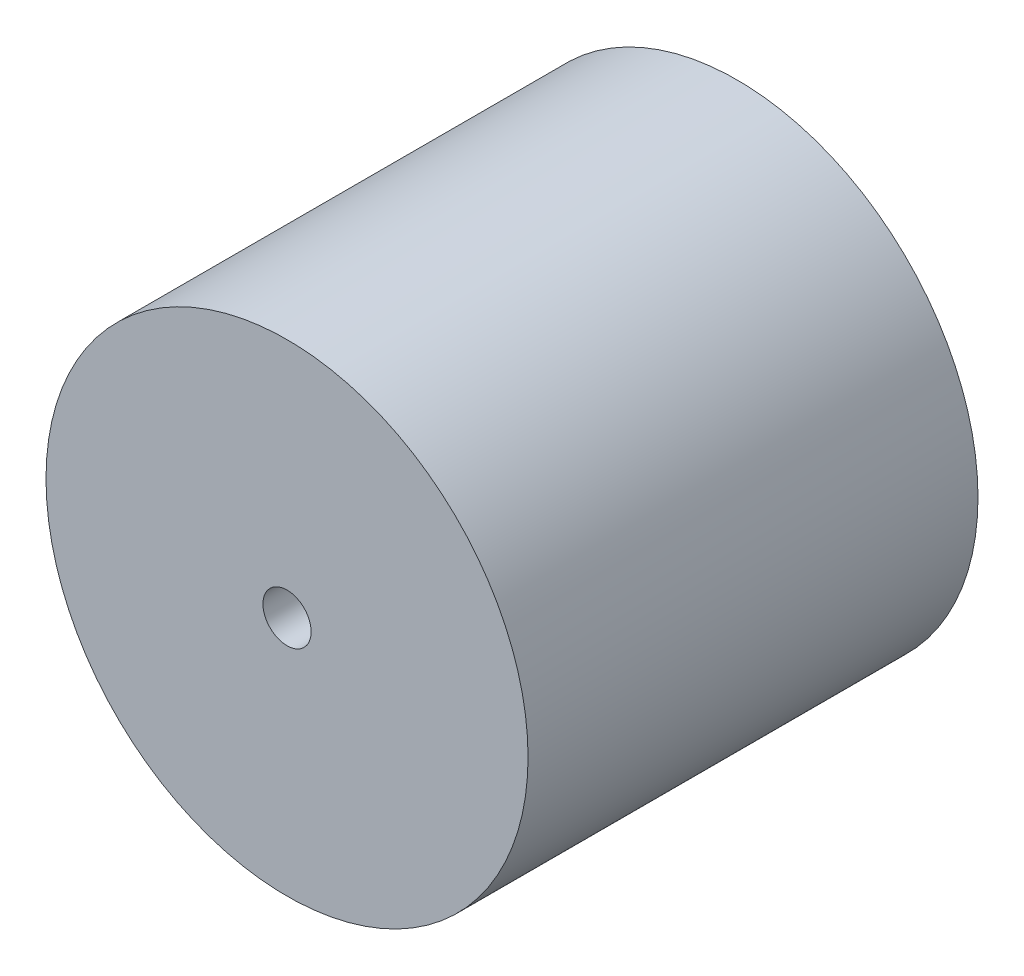
ISO-10303-21;
HEADER;
FILE_DESCRIPTION(('STEP AP214'),'2;1');
FILE_NAME('part.step','',(''),(''),'','','');
FILE_SCHEMA(('AUTOMOTIVE_DESIGN { 1 0 10303 214 1 1 1 1 }'));
ENDSEC;
DATA;
#1=APPLICATION_CONTEXT('core data for automotive mechanical design processes');
#2=APPLICATION_PROTOCOL_DEFINITION('international standard','automotive_design',2000,#1);
#3=PRODUCT_CONTEXT('',#1,'mechanical');
#4=PRODUCT('Part','Part','',(#3));
#5=PRODUCT_RELATED_PRODUCT_CATEGORY('part','',(#4));
#6=PRODUCT_DEFINITION_FORMATION('','',#4);
#7=PRODUCT_DEFINITION_CONTEXT('part definition',#1,'design');
#8=PRODUCT_DEFINITION('design','',#6,#7);
#9=PRODUCT_DEFINITION_SHAPE('','',#8);
#10=(LENGTH_UNIT() NAMED_UNIT(*) SI_UNIT(.MILLI.,.METRE.));
#11=(NAMED_UNIT(*) PLANE_ANGLE_UNIT() SI_UNIT($,.RADIAN.));
#12=(NAMED_UNIT(*) SI_UNIT($,.STERADIAN.) SOLID_ANGLE_UNIT());
#13=UNCERTAINTY_MEASURE_WITH_UNIT(LENGTH_MEASURE(1.E-05),#10,'distance_accuracy_value','');
#14=(GEOMETRIC_REPRESENTATION_CONTEXT(3) GLOBAL_UNCERTAINTY_ASSIGNED_CONTEXT((#13)) GLOBAL_UNIT_ASSIGNED_CONTEXT((#10,
#11,#12)) REPRESENTATION_CONTEXT('',''));
#15=CARTESIAN_POINT('',(0.,0.,0.));
#16=DIRECTION('',(0.,0.,1.));
#17=DIRECTION('',(1.,0.,0.));
#18=AXIS2_PLACEMENT_3D('',#15,#16,#17);
#19=CARTESIAN_POINT('',(0.,0.,28.));
#20=DIRECTION('',(0.,0.,-1.));
#21=DIRECTION('',(-1.,0.,0.));
#22=AXIS2_PLACEMENT_3D('',#19,#20,#21);
#23=CYLINDRICAL_SURFACE('',#22,15.);
#24=CARTESIAN_POINT('',(0.,0.,28.));
#25=DIRECTION('',(0.,0.,1.));
#26=DIRECTION('',(1.,0.,0.));
#27=AXIS2_PLACEMENT_3D('',#24,#25,#26);
#28=CIRCLE('',#27,15.);
#29=CARTESIAN_POINT('',(15.,0.,28.));
#30=VERTEX_POINT('',#29);
#31=EDGE_CURVE('E10',#30,#30,#28,.T.);
#32=ORIENTED_EDGE('',*,*,#31,.F.);
#33=EDGE_LOOP('',(#32));
#34=FACE_BOUND('',#33,.T.);
#35=CARTESIAN_POINT('',(0.,0.,0.));
#36=DIRECTION('',(0.,0.,1.));
#37=DIRECTION('',(1.,0.,0.));
#38=AXIS2_PLACEMENT_3D('',#35,#36,#37);
#39=CIRCLE('',#38,15.);
#40=CARTESIAN_POINT('',(15.,0.,0.));
#41=VERTEX_POINT('',#40);
#42=EDGE_CURVE('E44',#41,#41,#39,.T.);
#43=ORIENTED_EDGE('',*,*,#42,.T.);
#44=EDGE_LOOP('',(#43));
#45=FACE_BOUND('',#44,.T.);
#46=ADVANCED_FACE('F41',(#34,#45),#23,.T.);
#47=CARTESIAN_POINT('',(0.,0.,28.));
#48=DIRECTION('',(0.,0.,1.));
#49=DIRECTION('',(1.,0.,0.));
#50=AXIS2_PLACEMENT_3D('',#47,#48,#49);
#51=PLANE('',#50);
#52=CARTESIAN_POINT('',(0.,0.,28.));
#53=DIRECTION('',(0.,0.,1.));
#54=DIRECTION('',(1.,0.,0.));
#55=AXIS2_PLACEMENT_3D('',#52,#53,#54);
#56=CIRCLE('',#55,1.5);
#57=CARTESIAN_POINT('',(1.5,0.,28.));
#58=VERTEX_POINT('',#57);
#59=EDGE_CURVE('E55',#58,#58,#56,.T.);
#60=ORIENTED_EDGE('',*,*,#59,.F.);
#61=EDGE_LOOP('',(#60));
#62=FACE_BOUND('',#61,.T.);
#63=ORIENTED_EDGE('',*,*,#31,.T.);
#64=EDGE_LOOP('',(#63));
#65=FACE_BOUND('',#64,.T.);
#66=ADVANCED_FACE('F83',(#62,#65),#51,.T.);
#67=CARTESIAN_POINT('',(0.,0.,0.));
#68=DIRECTION('',(0.,0.,1.));
#69=DIRECTION('',(1.,0.,0.));
#70=AXIS2_PLACEMENT_3D('',#67,#68,#69);
#71=PLANE('',#70);
#72=CARTESIAN_POINT('',(0.,0.,0.));
#73=DIRECTION('',(0.,0.,1.));
#74=DIRECTION('',(1.,0.,0.));
#75=AXIS2_PLACEMENT_3D('',#72,#73,#74);
#76=CIRCLE('',#75,1.5);
#77=CARTESIAN_POINT('',(1.5,0.,0.));
#78=VERTEX_POINT('',#77);
#79=EDGE_CURVE('E63',#78,#78,#76,.T.);
#80=ORIENTED_EDGE('',*,*,#79,.T.);
#81=EDGE_LOOP('',(#80));
#82=FACE_BOUND('',#81,.T.);
#83=ORIENTED_EDGE('',*,*,#42,.F.);
#84=EDGE_LOOP('',(#83));
#85=FACE_BOUND('',#84,.T.);
#86=ADVANCED_FACE('F88',(#82,#85),#71,.F.);
#87=CARTESIAN_POINT('',(0.,0.,18.));
#88=DIRECTION('',(0.,0.,1.));
#89=DIRECTION('',(1.,0.,0.));
#90=AXIS2_PLACEMENT_3D('',#87,#88,#89);
#91=CYLINDRICAL_SURFACE('',#90,1.5);
#92=CARTESIAN_POINT('',(0.,0.,18.));
#93=DIRECTION('',(0.,0.,1.));
#94=DIRECTION('',(1.,0.,0.));
#95=AXIS2_PLACEMENT_3D('',#92,#93,#94);
#96=CIRCLE('',#95,1.5);
#97=CARTESIAN_POINT('',(1.5,0.,18.));
#98=VERTEX_POINT('',#97);
#99=EDGE_CURVE('E53',#98,#98,#96,.T.);
#100=ORIENTED_EDGE('',*,*,#99,.F.);
#101=EDGE_LOOP('',(#100));
#102=FACE_BOUND('',#101,.T.);
#103=ORIENTED_EDGE('',*,*,#59,.T.);
#104=EDGE_LOOP('',(#103));
#105=FACE_BOUND('',#104,.T.);
#106=ADVANCED_FACE('F95',(#102,#105),#91,.F.);
#107=CARTESIAN_POINT('',(0.,0.,18.));
#108=DIRECTION('',(0.,0.,1.));
#109=DIRECTION('',(1.,0.,0.));
#110=AXIS2_PLACEMENT_3D('',#107,#108,#109);
#111=PLANE('',#110);
#112=ORIENTED_EDGE('',*,*,#99,.T.);
#113=EDGE_LOOP('',(#112));
#114=FACE_BOUND('',#113,.T.);
#115=ADVANCED_FACE('F80',(#114),#111,.T.);
#116=CARTESIAN_POINT('',(0.,0.,10.));
#117=DIRECTION('',(0.,0.,-1.));
#118=DIRECTION('',(-1.,0.,0.));
#119=AXIS2_PLACEMENT_3D('',#116,#117,#118);
#120=CYLINDRICAL_SURFACE('',#119,1.5);
#121=CARTESIAN_POINT('',(0.,0.,10.));
#122=DIRECTION('',(0.,0.,1.));
#123=DIRECTION('',(1.,0.,0.));
#124=AXIS2_PLACEMENT_3D('',#121,#122,#123);
#125=CIRCLE('',#124,1.5);
#126=CARTESIAN_POINT('',(1.5,0.,10.));
#127=VERTEX_POINT('',#126);
#128=EDGE_CURVE('E59',#127,#127,#125,.T.);
#129=ORIENTED_EDGE('',*,*,#128,.T.);
#130=EDGE_LOOP('',(#129));
#131=FACE_BOUND('',#130,.T.);
#132=ORIENTED_EDGE('',*,*,#79,.F.);
#133=EDGE_LOOP('',(#132));
#134=FACE_BOUND('',#133,.T.);
#135=ADVANCED_FACE('F71',(#131,#134),#120,.F.);
#136=CARTESIAN_POINT('',(0.,0.,10.));
#137=DIRECTION('',(0.,0.,1.));
#138=DIRECTION('',(1.,0.,0.));
#139=AXIS2_PLACEMENT_3D('',#136,#137,#138);
#140=PLANE('',#139);
#141=ORIENTED_EDGE('',*,*,#128,.F.);
#142=EDGE_LOOP('',(#141));
#143=FACE_BOUND('',#142,.T.);
#144=ADVANCED_FACE('F74',(#143),#140,.F.);
#145=CLOSED_SHELL('',(#46,#66,#86,#106,#115,#135,#144));
#146=MANIFOLD_SOLID_BREP('B2',#145);
#147=ADVANCED_BREP_SHAPE_REPRESENTATION('',(#18,#146),#14);
#148=SHAPE_DEFINITION_REPRESENTATION(#9,#147);
ENDSEC;
END-ISO-10303-21;
